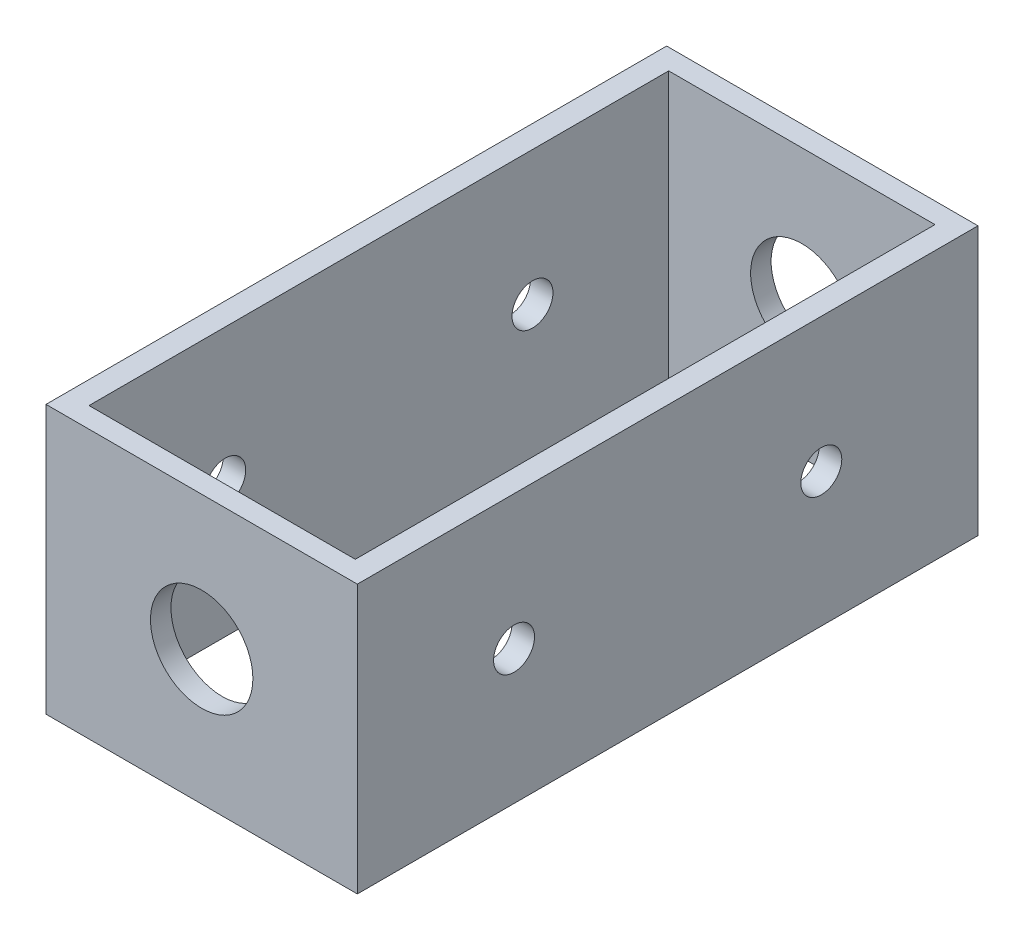
ISO-10303-21;
HEADER;
FILE_DESCRIPTION(('STEP AP214'),'2;1');
FILE_NAME('part.step','',(''),(''),'','','');
FILE_SCHEMA(('AUTOMOTIVE_DESIGN { 1 0 10303 214 1 1 1 1 }'));
ENDSEC;
DATA;
#1=APPLICATION_CONTEXT('core data for automotive mechanical design processes');
#2=APPLICATION_PROTOCOL_DEFINITION('international standard','automotive_design',2000,#1);
#3=PRODUCT_CONTEXT('',#1,'mechanical');
#4=PRODUCT('Part','Part','',(#3));
#5=PRODUCT_RELATED_PRODUCT_CATEGORY('part','',(#4));
#6=PRODUCT_DEFINITION_FORMATION('','',#4);
#7=PRODUCT_DEFINITION_CONTEXT('part definition',#1,'design');
#8=PRODUCT_DEFINITION('design','',#6,#7);
#9=PRODUCT_DEFINITION_SHAPE('','',#8);
#10=(LENGTH_UNIT() NAMED_UNIT(*) SI_UNIT(.MILLI.,.METRE.));
#11=(NAMED_UNIT(*) PLANE_ANGLE_UNIT() SI_UNIT($,.RADIAN.));
#12=(NAMED_UNIT(*) SI_UNIT($,.STERADIAN.) SOLID_ANGLE_UNIT());
#13=UNCERTAINTY_MEASURE_WITH_UNIT(LENGTH_MEASURE(1.E-05),#10,'distance_accuracy_value','');
#14=(GEOMETRIC_REPRESENTATION_CONTEXT(3) GLOBAL_UNCERTAINTY_ASSIGNED_CONTEXT((#13)) GLOBAL_UNIT_ASSIGNED_CONTEXT((#10,
#11,#12)) REPRESENTATION_CONTEXT('',''));
#15=CARTESIAN_POINT('',(0.,0.,0.));
#16=DIRECTION('',(0.,0.,1.));
#17=DIRECTION('',(1.,0.,0.));
#18=AXIS2_PLACEMENT_3D('',#15,#16,#17);
#19=CARTESIAN_POINT('',(0.,13.1,0.));
#20=DIRECTION('',(0.,-1.,0.));
#21=DIRECTION('',(0.,0.,-1.));
#22=AXIS2_PLACEMENT_3D('',#19,#20,#21);
#23=PLANE('',#22);
#24=DIRECTION('',(0.,0.,-1.));
#25=VECTOR('',#24,1.);
#26=CARTESIAN_POINT('',(7.6,13.1,15.15));
#27=LINE('',#26,#25);
#28=CARTESIAN_POINT('',(7.6,13.1,15.15));
#29=VERTEX_POINT('',#28);
#30=CARTESIAN_POINT('',(7.6,13.1,-15.15));
#31=VERTEX_POINT('',#30);
#32=EDGE_CURVE('E144',#29,#31,#27,.T.);
#33=ORIENTED_EDGE('',*,*,#32,.T.);
#34=DIRECTION('',(-1.,0.,0.));
#35=VECTOR('',#34,1.);
#36=CARTESIAN_POINT('',(-7.6,13.1,-15.15));
#37=LINE('',#36,#35);
#38=CARTESIAN_POINT('',(-7.6,13.1,-15.15));
#39=VERTEX_POINT('',#38);
#40=EDGE_CURVE('E147',#31,#39,#37,.T.);
#41=ORIENTED_EDGE('',*,*,#40,.T.);
#42=DIRECTION('',(0.,0.,1.));
#43=VECTOR('',#42,1.);
#44=CARTESIAN_POINT('',(-7.6,13.1,15.15));
#45=LINE('',#44,#43);
#46=CARTESIAN_POINT('',(-7.6,13.1,15.15));
#47=VERTEX_POINT('',#46);
#48=EDGE_CURVE('E150',#39,#47,#45,.T.);
#49=ORIENTED_EDGE('',*,*,#48,.T.);
#50=DIRECTION('',(1.,0.,0.));
#51=VECTOR('',#50,1.);
#52=CARTESIAN_POINT('',(-7.6,13.1,15.15));
#53=LINE('',#52,#51);
#54=EDGE_CURVE('E152',#47,#29,#53,.T.);
#55=ORIENTED_EDGE('',*,*,#54,.T.);
#56=EDGE_LOOP('',(#33,#41,#49,#55));
#57=FACE_BOUND('',#56,.T.);
#58=DIRECTION('',(0.,0.,-1.));
#59=VECTOR('',#58,1.);
#60=CARTESIAN_POINT('',(6.5,13.1,14.15));
#61=LINE('',#60,#59);
#62=CARTESIAN_POINT('',(6.5,13.1,14.15));
#63=VERTEX_POINT('',#62);
#64=CARTESIAN_POINT('',(6.5,13.1,-14.15));
#65=VERTEX_POINT('',#64);
#66=EDGE_CURVE('E106',#63,#65,#61,.T.);
#67=ORIENTED_EDGE('',*,*,#66,.F.);
#68=DIRECTION('',(1.,0.,0.));
#69=VECTOR('',#68,1.);
#70=CARTESIAN_POINT('',(-6.5,13.1,14.15));
#71=LINE('',#70,#69);
#72=CARTESIAN_POINT('',(-6.5,13.1,14.15));
#73=VERTEX_POINT('',#72);
#74=EDGE_CURVE('E128',#73,#63,#71,.T.);
#75=ORIENTED_EDGE('',*,*,#74,.F.);
#76=DIRECTION('',(0.,0.,1.));
#77=VECTOR('',#76,1.);
#78=CARTESIAN_POINT('',(-6.5,13.1,14.15));
#79=LINE('',#78,#77);
#80=CARTESIAN_POINT('',(-6.5,13.1,-14.15));
#81=VERTEX_POINT('',#80);
#82=EDGE_CURVE('E126',#81,#73,#79,.T.);
#83=ORIENTED_EDGE('',*,*,#82,.F.);
#84=DIRECTION('',(-1.,0.,0.));
#85=VECTOR('',#84,1.);
#86=CARTESIAN_POINT('',(-6.5,13.1,-14.15));
#87=LINE('',#86,#85);
#88=EDGE_CURVE('E114',#65,#81,#87,.T.);
#89=ORIENTED_EDGE('',*,*,#88,.F.);
#90=EDGE_LOOP('',(#67,#75,#83,#89));
#91=FACE_BOUND('',#90,.T.);
#92=ADVANCED_FACE('F39',(#57,#91),#23,.F.);
#93=CARTESIAN_POINT('',(0.,0.,0.));
#94=DIRECTION('',(0.,-1.,0.));
#95=DIRECTION('',(0.,0.,-1.));
#96=AXIS2_PLACEMENT_3D('',#93,#94,#95);
#97=PLANE('',#96);
#98=DIRECTION('',(0.,0.,-1.));
#99=VECTOR('',#98,1.);
#100=CARTESIAN_POINT('',(7.6,0.,15.15));
#101=LINE('',#100,#99);
#102=CARTESIAN_POINT('',(7.6,0.,15.15));
#103=VERTEX_POINT('',#102);
#104=CARTESIAN_POINT('',(7.6,0.,-15.15));
#105=VERTEX_POINT('',#104);
#106=EDGE_CURVE('E122',#103,#105,#101,.T.);
#107=ORIENTED_EDGE('',*,*,#106,.F.);
#108=DIRECTION('',(1.,0.,0.));
#109=VECTOR('',#108,1.);
#110=CARTESIAN_POINT('',(-7.6,0.,15.15));
#111=LINE('',#110,#109);
#112=CARTESIAN_POINT('',(-7.6,0.,15.15));
#113=VERTEX_POINT('',#112);
#114=EDGE_CURVE('E148',#113,#103,#111,.T.);
#115=ORIENTED_EDGE('',*,*,#114,.F.);
#116=DIRECTION('',(0.,0.,1.));
#117=VECTOR('',#116,1.);
#118=CARTESIAN_POINT('',(-7.6,0.,15.15));
#119=LINE('',#118,#117);
#120=CARTESIAN_POINT('',(-7.6,0.,-15.15));
#121=VERTEX_POINT('',#120);
#122=EDGE_CURVE('E159',#121,#113,#119,.T.);
#123=ORIENTED_EDGE('',*,*,#122,.F.);
#124=DIRECTION('',(-1.,0.,0.));
#125=VECTOR('',#124,1.);
#126=CARTESIAN_POINT('',(-7.6,0.,-15.15));
#127=LINE('',#126,#125);
#128=EDGE_CURVE('E157',#105,#121,#127,.T.);
#129=ORIENTED_EDGE('',*,*,#128,.F.);
#130=EDGE_LOOP('',(#107,#115,#123,#129));
#131=FACE_BOUND('',#130,.T.);
#132=DIRECTION('',(1.,0.,0.));
#133=VECTOR('',#132,1.);
#134=CARTESIAN_POINT('',(-6.5,0.,14.15));
#135=LINE('',#134,#133);
#136=CARTESIAN_POINT('',(-6.5,0.,14.15));
#137=VERTEX_POINT('',#136);
#138=CARTESIAN_POINT('',(6.5,0.,14.15));
#139=VERTEX_POINT('',#138);
#140=EDGE_CURVE('E115',#137,#139,#135,.T.);
#141=ORIENTED_EDGE('',*,*,#140,.T.);
#142=DIRECTION('',(0.,0.,-1.));
#143=VECTOR('',#142,1.);
#144=CARTESIAN_POINT('',(6.5,0.,14.15));
#145=LINE('',#144,#143);
#146=CARTESIAN_POINT('',(6.5,0.,-14.15));
#147=VERTEX_POINT('',#146);
#148=EDGE_CURVE('E64',#139,#147,#145,.T.);
#149=ORIENTED_EDGE('',*,*,#148,.T.);
#150=DIRECTION('',(-1.,0.,0.));
#151=VECTOR('',#150,1.);
#152=CARTESIAN_POINT('',(-6.5,0.,-14.15));
#153=LINE('',#152,#151);
#154=CARTESIAN_POINT('',(-6.5,0.,-14.15));
#155=VERTEX_POINT('',#154);
#156=EDGE_CURVE('E121',#147,#155,#153,.T.);
#157=ORIENTED_EDGE('',*,*,#156,.T.);
#158=DIRECTION('',(0.,0.,1.));
#159=VECTOR('',#158,1.);
#160=CARTESIAN_POINT('',(-6.5,0.,14.15));
#161=LINE('',#160,#159);
#162=EDGE_CURVE('E136',#155,#137,#161,.T.);
#163=ORIENTED_EDGE('',*,*,#162,.T.);
#164=EDGE_LOOP('',(#141,#149,#157,#163));
#165=FACE_BOUND('',#164,.T.);
#166=ADVANCED_FACE('F217',(#131,#165),#97,.T.);
#167=CARTESIAN_POINT('',(7.6,13.1,15.15));
#168=DIRECTION('',(-1.,0.,0.));
#169=DIRECTION('',(0.,0.,1.));
#170=AXIS2_PLACEMENT_3D('',#167,#168,#169);
#171=PLANE('',#170);
#172=CARTESIAN_POINT('',(7.6,6.55,7.5));
#173=DIRECTION('',(1.,0.,0.));
#174=DIRECTION('',(0.,0.,-1.));
#175=AXIS2_PLACEMENT_3D('',#172,#173,#174);
#176=CIRCLE('',#175,1.);
#177=CARTESIAN_POINT('',(7.6,6.55,6.5));
#178=VERTEX_POINT('',#177);
#179=EDGE_CURVE('E190',#178,#178,#176,.T.);
#180=ORIENTED_EDGE('',*,*,#179,.F.);
#181=EDGE_LOOP('',(#180));
#182=FACE_BOUND('',#181,.T.);
#183=CARTESIAN_POINT('',(7.6,6.55,-7.5));
#184=DIRECTION('',(1.,0.,0.));
#185=DIRECTION('',(0.,0.,-1.));
#186=AXIS2_PLACEMENT_3D('',#183,#184,#185);
#187=CIRCLE('',#186,1.);
#188=CARTESIAN_POINT('',(7.6,6.55,-8.5));
#189=VERTEX_POINT('',#188);
#190=EDGE_CURVE('E183',#189,#189,#187,.T.);
#191=ORIENTED_EDGE('',*,*,#190,.F.);
#192=EDGE_LOOP('',(#191));
#193=FACE_BOUND('',#192,.T.);
#194=ORIENTED_EDGE('',*,*,#106,.T.);
#195=DIRECTION('',(0.,-1.,0.));
#196=VECTOR('',#195,1.);
#197=CARTESIAN_POINT('',(7.6,13.1,-15.15));
#198=LINE('',#197,#196);
#199=EDGE_CURVE('E11',#31,#105,#198,.T.);
#200=ORIENTED_EDGE('',*,*,#199,.F.);
#201=ORIENTED_EDGE('',*,*,#32,.F.);
#202=DIRECTION('',(0.,-1.,0.));
#203=VECTOR('',#202,1.);
#204=CARTESIAN_POINT('',(7.6,13.1,15.15));
#205=LINE('',#204,#203);
#206=EDGE_CURVE('E154',#29,#103,#205,.T.);
#207=ORIENTED_EDGE('',*,*,#206,.T.);
#208=EDGE_LOOP('',(#194,#200,#201,#207));
#209=FACE_BOUND('',#208,.T.);
#210=ADVANCED_FACE('F41',(#182,#193,#209),#171,.F.);
#211=CARTESIAN_POINT('',(-7.6,13.1,-15.15));
#212=DIRECTION('',(0.,0.,1.));
#213=DIRECTION('',(1.,0.,0.));
#214=AXIS2_PLACEMENT_3D('',#211,#212,#213);
#215=PLANE('',#214);
#216=CARTESIAN_POINT('',(0.,6.55,-15.15));
#217=DIRECTION('',(0.,0.,1.));
#218=DIRECTION('',(1.,0.,0.));
#219=AXIS2_PLACEMENT_3D('',#216,#217,#218);
#220=CIRCLE('',#219,2.5);
#221=CARTESIAN_POINT('',(2.5,6.55,-15.15));
#222=VERTEX_POINT('',#221);
#223=EDGE_CURVE('E200',#222,#222,#220,.T.);
#224=ORIENTED_EDGE('',*,*,#223,.T.);
#225=EDGE_LOOP('',(#224));
#226=FACE_BOUND('',#225,.T.);
#227=ORIENTED_EDGE('',*,*,#128,.T.);
#228=DIRECTION('',(0.,-1.,0.));
#229=VECTOR('',#228,1.);
#230=CARTESIAN_POINT('',(-7.6,13.1,-15.15));
#231=LINE('',#230,#229);
#232=EDGE_CURVE('E48',#39,#121,#231,.T.);
#233=ORIENTED_EDGE('',*,*,#232,.F.);
#234=ORIENTED_EDGE('',*,*,#40,.F.);
#235=ORIENTED_EDGE('',*,*,#199,.T.);
#236=EDGE_LOOP('',(#227,#233,#234,#235));
#237=FACE_BOUND('',#236,.T.);
#238=ADVANCED_FACE('F244',(#226,#237),#215,.F.);
#239=CARTESIAN_POINT('',(-7.6,13.1,15.15));
#240=DIRECTION('',(1.,0.,0.));
#241=DIRECTION('',(0.,0.,-1.));
#242=AXIS2_PLACEMENT_3D('',#239,#240,#241);
#243=PLANE('',#242);
#244=CARTESIAN_POINT('',(-7.6,6.55,7.5));
#245=DIRECTION('',(1.,0.,0.));
#246=DIRECTION('',(0.,0.,-1.));
#247=AXIS2_PLACEMENT_3D('',#244,#245,#246);
#248=CIRCLE('',#247,1.);
#249=CARTESIAN_POINT('',(-7.6,6.55,6.5));
#250=VERTEX_POINT('',#249);
#251=EDGE_CURVE('E172',#250,#250,#248,.T.);
#252=ORIENTED_EDGE('',*,*,#251,.T.);
#253=EDGE_LOOP('',(#252));
#254=FACE_BOUND('',#253,.T.);
#255=CARTESIAN_POINT('',(-7.6,6.55,-7.5));
#256=DIRECTION('',(1.,0.,0.));
#257=DIRECTION('',(0.,0.,-1.));
#258=AXIS2_PLACEMENT_3D('',#255,#256,#257);
#259=CIRCLE('',#258,1.);
#260=CARTESIAN_POINT('',(-7.6,6.55,-8.5));
#261=VERTEX_POINT('',#260);
#262=EDGE_CURVE('E186',#261,#261,#259,.T.);
#263=ORIENTED_EDGE('',*,*,#262,.T.);
#264=EDGE_LOOP('',(#263));
#265=FACE_BOUND('',#264,.T.);
#266=ORIENTED_EDGE('',*,*,#122,.T.);
#267=DIRECTION('',(0.,-1.,0.));
#268=VECTOR('',#267,1.);
#269=CARTESIAN_POINT('',(-7.6,13.1,15.15));
#270=LINE('',#269,#268);
#271=EDGE_CURVE('E164',#47,#113,#270,.T.);
#272=ORIENTED_EDGE('',*,*,#271,.F.);
#273=ORIENTED_EDGE('',*,*,#48,.F.);
#274=ORIENTED_EDGE('',*,*,#232,.T.);
#275=EDGE_LOOP('',(#266,#272,#273,#274));
#276=FACE_BOUND('',#275,.T.);
#277=ADVANCED_FACE('F241',(#254,#265,#276),#243,.F.);
#278=CARTESIAN_POINT('',(-7.6,13.1,15.15));
#279=DIRECTION('',(0.,0.,-1.));
#280=DIRECTION('',(-1.,0.,0.));
#281=AXIS2_PLACEMENT_3D('',#278,#279,#280);
#282=PLANE('',#281);
#283=CARTESIAN_POINT('',(0.,6.55,15.15));
#284=DIRECTION('',(0.,0.,1.));
#285=DIRECTION('',(1.,0.,0.));
#286=AXIS2_PLACEMENT_3D('',#283,#284,#285);
#287=CIRCLE('',#286,2.5);
#288=CARTESIAN_POINT('',(2.5,6.55,15.15));
#289=VERTEX_POINT('',#288);
#290=EDGE_CURVE('E197',#289,#289,#287,.T.);
#291=ORIENTED_EDGE('',*,*,#290,.F.);
#292=EDGE_LOOP('',(#291));
#293=FACE_BOUND('',#292,.T.);
#294=ORIENTED_EDGE('',*,*,#114,.T.);
#295=ORIENTED_EDGE('',*,*,#206,.F.);
#296=ORIENTED_EDGE('',*,*,#54,.F.);
#297=ORIENTED_EDGE('',*,*,#271,.T.);
#298=EDGE_LOOP('',(#294,#295,#296,#297));
#299=FACE_BOUND('',#298,.T.);
#300=ADVANCED_FACE('F238',(#293,#299),#282,.F.);
#301=CARTESIAN_POINT('',(6.5,13.1,14.15));
#302=DIRECTION('',(-1.,0.,0.));
#303=DIRECTION('',(0.,0.,1.));
#304=AXIS2_PLACEMENT_3D('',#301,#302,#303);
#305=PLANE('',#304);
#306=CARTESIAN_POINT('',(6.5,6.55,7.5));
#307=DIRECTION('',(-1.,0.,0.));
#308=DIRECTION('',(0.,0.,1.));
#309=AXIS2_PLACEMENT_3D('',#306,#307,#308);
#310=CIRCLE('',#309,1.);
#311=CARTESIAN_POINT('',(6.5,6.55,8.5));
#312=VERTEX_POINT('',#311);
#313=EDGE_CURVE('E134',#312,#312,#310,.T.);
#314=ORIENTED_EDGE('',*,*,#313,.F.);
#315=EDGE_LOOP('',(#314));
#316=FACE_BOUND('',#315,.T.);
#317=CARTESIAN_POINT('',(6.5,6.55,-7.5));
#318=DIRECTION('',(-1.,0.,0.));
#319=DIRECTION('',(0.,0.,1.));
#320=AXIS2_PLACEMENT_3D('',#317,#318,#319);
#321=CIRCLE('',#320,1.);
#322=CARTESIAN_POINT('',(6.5,6.55,-6.5));
#323=VERTEX_POINT('',#322);
#324=EDGE_CURVE('E171',#323,#323,#321,.T.);
#325=ORIENTED_EDGE('',*,*,#324,.F.);
#326=EDGE_LOOP('',(#325));
#327=FACE_BOUND('',#326,.T.);
#328=ORIENTED_EDGE('',*,*,#148,.F.);
#329=DIRECTION('',(0.,-1.,0.));
#330=VECTOR('',#329,1.);
#331=CARTESIAN_POINT('',(6.5,13.1,14.15));
#332=LINE('',#331,#330);
#333=EDGE_CURVE('E110',#63,#139,#332,.T.);
#334=ORIENTED_EDGE('',*,*,#333,.F.);
#335=ORIENTED_EDGE('',*,*,#66,.T.);
#336=DIRECTION('',(0.,-1.,0.));
#337=VECTOR('',#336,1.);
#338=CARTESIAN_POINT('',(6.5,13.1,-14.15));
#339=LINE('',#338,#337);
#340=EDGE_CURVE('E109',#65,#147,#339,.T.);
#341=ORIENTED_EDGE('',*,*,#340,.T.);
#342=EDGE_LOOP('',(#328,#334,#335,#341));
#343=FACE_BOUND('',#342,.T.);
#344=ADVANCED_FACE('F108',(#316,#327,#343),#305,.T.);
#345=CARTESIAN_POINT('',(-6.5,13.1,-14.15));
#346=DIRECTION('',(0.,0.,1.));
#347=DIRECTION('',(1.,0.,0.));
#348=AXIS2_PLACEMENT_3D('',#345,#346,#347);
#349=PLANE('',#348);
#350=CARTESIAN_POINT('',(0.,6.55,-14.15));
#351=DIRECTION('',(0.,0.,1.));
#352=DIRECTION('',(1.,0.,0.));
#353=AXIS2_PLACEMENT_3D('',#350,#351,#352);
#354=CIRCLE('',#353,2.5);
#355=CARTESIAN_POINT('',(2.5,6.55,-14.15));
#356=VERTEX_POINT('',#355);
#357=EDGE_CURVE('E187',#356,#356,#354,.T.);
#358=ORIENTED_EDGE('',*,*,#357,.F.);
#359=EDGE_LOOP('',(#358));
#360=FACE_BOUND('',#359,.T.);
#361=ORIENTED_EDGE('',*,*,#156,.F.);
#362=ORIENTED_EDGE('',*,*,#340,.F.);
#363=ORIENTED_EDGE('',*,*,#88,.T.);
#364=DIRECTION('',(0.,-1.,0.));
#365=VECTOR('',#364,1.);
#366=CARTESIAN_POINT('',(-6.5,13.1,-14.15));
#367=LINE('',#366,#365);
#368=EDGE_CURVE('E123',#81,#155,#367,.T.);
#369=ORIENTED_EDGE('',*,*,#368,.T.);
#370=EDGE_LOOP('',(#361,#362,#363,#369));
#371=FACE_BOUND('',#370,.T.);
#372=ADVANCED_FACE('F118',(#360,#371),#349,.T.);
#373=CARTESIAN_POINT('',(-6.5,13.1,14.15));
#374=DIRECTION('',(1.,0.,0.));
#375=DIRECTION('',(0.,0.,-1.));
#376=AXIS2_PLACEMENT_3D('',#373,#374,#375);
#377=PLANE('',#376);
#378=CARTESIAN_POINT('',(-6.5,6.55,7.5));
#379=DIRECTION('',(1.,0.,0.));
#380=DIRECTION('',(0.,0.,-1.));
#381=AXIS2_PLACEMENT_3D('',#378,#379,#380);
#382=CIRCLE('',#381,1.);
#383=CARTESIAN_POINT('',(-6.5,6.55,6.5));
#384=VERTEX_POINT('',#383);
#385=EDGE_CURVE('E173',#384,#384,#382,.T.);
#386=ORIENTED_EDGE('',*,*,#385,.F.);
#387=EDGE_LOOP('',(#386));
#388=FACE_BOUND('',#387,.T.);
#389=CARTESIAN_POINT('',(-6.5,6.55,-7.5));
#390=DIRECTION('',(1.,0.,0.));
#391=DIRECTION('',(0.,0.,-1.));
#392=AXIS2_PLACEMENT_3D('',#389,#390,#391);
#393=CIRCLE('',#392,1.);
#394=CARTESIAN_POINT('',(-6.5,6.55,-8.5));
#395=VERTEX_POINT('',#394);
#396=EDGE_CURVE('E169',#395,#395,#393,.T.);
#397=ORIENTED_EDGE('',*,*,#396,.F.);
#398=EDGE_LOOP('',(#397));
#399=FACE_BOUND('',#398,.T.);
#400=ORIENTED_EDGE('',*,*,#162,.F.);
#401=ORIENTED_EDGE('',*,*,#368,.F.);
#402=ORIENTED_EDGE('',*,*,#82,.T.);
#403=DIRECTION('',(0.,-1.,0.));
#404=VECTOR('',#403,1.);
#405=CARTESIAN_POINT('',(-6.5,13.1,14.15));
#406=LINE('',#405,#404);
#407=EDGE_CURVE('E56',#73,#137,#406,.T.);
#408=ORIENTED_EDGE('',*,*,#407,.T.);
#409=EDGE_LOOP('',(#400,#401,#402,#408));
#410=FACE_BOUND('',#409,.T.);
#411=ADVANCED_FACE('F213',(#388,#399,#410),#377,.T.);
#412=CARTESIAN_POINT('',(-6.5,13.1,14.15));
#413=DIRECTION('',(0.,0.,-1.));
#414=DIRECTION('',(-1.,0.,0.));
#415=AXIS2_PLACEMENT_3D('',#412,#413,#414);
#416=PLANE('',#415);
#417=CARTESIAN_POINT('',(0.,6.55,14.15));
#418=DIRECTION('',(0.,0.,-1.));
#419=DIRECTION('',(-1.,0.,0.));
#420=AXIS2_PLACEMENT_3D('',#417,#418,#419);
#421=CIRCLE('',#420,2.5);
#422=CARTESIAN_POINT('',(-2.5,6.55,14.15));
#423=VERTEX_POINT('',#422);
#424=EDGE_CURVE('E43',#423,#423,#421,.T.);
#425=ORIENTED_EDGE('',*,*,#424,.F.);
#426=EDGE_LOOP('',(#425));
#427=FACE_BOUND('',#426,.T.);
#428=ORIENTED_EDGE('',*,*,#140,.F.);
#429=ORIENTED_EDGE('',*,*,#407,.F.);
#430=ORIENTED_EDGE('',*,*,#74,.T.);
#431=ORIENTED_EDGE('',*,*,#333,.T.);
#432=EDGE_LOOP('',(#428,#429,#430,#431));
#433=FACE_BOUND('',#432,.T.);
#434=ADVANCED_FACE('F210',(#427,#433),#416,.T.);
#435=CARTESIAN_POINT('',(-7.6,6.55,-7.5));
#436=DIRECTION('',(1.,0.,0.));
#437=DIRECTION('',(0.,0.,-1.));
#438=AXIS2_PLACEMENT_3D('',#435,#436,#437);
#439=CYLINDRICAL_SURFACE('',#438,1.);
#440=ORIENTED_EDGE('',*,*,#396,.T.);
#441=EDGE_LOOP('',(#440));
#442=FACE_BOUND('',#441,.T.);
#443=ORIENTED_EDGE('',*,*,#262,.F.);
#444=EDGE_LOOP('',(#443));
#445=FACE_BOUND('',#444,.T.);
#446=ADVANCED_FACE('F212',(#442,#445),#439,.F.);
#447=CARTESIAN_POINT('',(-7.6,6.55,7.5));
#448=DIRECTION('',(1.,0.,0.));
#449=DIRECTION('',(0.,0.,-1.));
#450=AXIS2_PLACEMENT_3D('',#447,#448,#449);
#451=CYLINDRICAL_SURFACE('',#450,1.);
#452=ORIENTED_EDGE('',*,*,#385,.T.);
#453=EDGE_LOOP('',(#452));
#454=FACE_BOUND('',#453,.T.);
#455=ORIENTED_EDGE('',*,*,#251,.F.);
#456=EDGE_LOOP('',(#455));
#457=FACE_BOUND('',#456,.T.);
#458=ADVANCED_FACE('F274',(#454,#457),#451,.F.);
#459=ORIENTED_EDGE('',*,*,#324,.T.);
#460=EDGE_LOOP('',(#459));
#461=FACE_BOUND('',#460,.T.);
#462=ORIENTED_EDGE('',*,*,#190,.T.);
#463=EDGE_LOOP('',(#462));
#464=FACE_BOUND('',#463,.T.);
#465=ADVANCED_FACE('F271',(#461,#464),#439,.F.);
#466=ORIENTED_EDGE('',*,*,#313,.T.);
#467=EDGE_LOOP('',(#466));
#468=FACE_BOUND('',#467,.T.);
#469=ORIENTED_EDGE('',*,*,#179,.T.);
#470=EDGE_LOOP('',(#469));
#471=FACE_BOUND('',#470,.T.);
#472=ADVANCED_FACE('F273',(#468,#471),#451,.F.);
#473=CARTESIAN_POINT('',(0.,6.55,-15.15));
#474=DIRECTION('',(0.,0.,1.));
#475=DIRECTION('',(1.,0.,0.));
#476=AXIS2_PLACEMENT_3D('',#473,#474,#475);
#477=CYLINDRICAL_SURFACE('',#476,2.5);
#478=ORIENTED_EDGE('',*,*,#424,.T.);
#479=EDGE_LOOP('',(#478));
#480=FACE_BOUND('',#479,.T.);
#481=ORIENTED_EDGE('',*,*,#290,.T.);
#482=EDGE_LOOP('',(#481));
#483=FACE_BOUND('',#482,.T.);
#484=ADVANCED_FACE('F207',(#480,#483),#477,.F.);
#485=ORIENTED_EDGE('',*,*,#357,.T.);
#486=EDGE_LOOP('',(#485));
#487=FACE_BOUND('',#486,.T.);
#488=ORIENTED_EDGE('',*,*,#223,.F.);
#489=EDGE_LOOP('',(#488));
#490=FACE_BOUND('',#489,.T.);
#491=ADVANCED_FACE('F340',(#487,#490),#477,.F.);
#492=CLOSED_SHELL('',(#92,#166,#210,#238,#277,#300,#344,#372,#411,#434,#446,#458,#465,#472,#484,#491));
#493=MANIFOLD_SOLID_BREP('B2',#492);
#494=ADVANCED_BREP_SHAPE_REPRESENTATION('',(#18,#493),#14);
#495=SHAPE_DEFINITION_REPRESENTATION(#9,#494);
ENDSEC;
END-ISO-10303-21;
